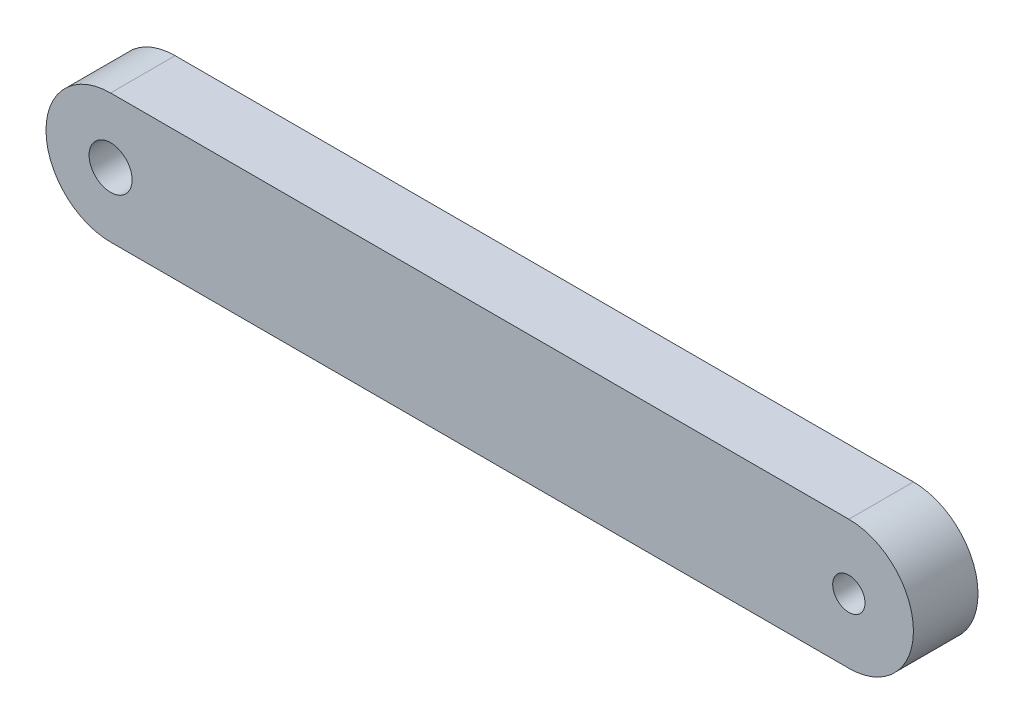
ISO-10303-21;
HEADER;
FILE_DESCRIPTION(('STEP AP214'),'2;1');
FILE_NAME('part.step','',(''),(''),'','','');
FILE_SCHEMA(('AUTOMOTIVE_DESIGN { 1 0 10303 214 1 1 1 1 }'));
ENDSEC;
DATA;
#1=APPLICATION_CONTEXT('core data for automotive mechanical design processes');
#2=APPLICATION_PROTOCOL_DEFINITION('international standard','automotive_design',2000,#1);
#3=PRODUCT_CONTEXT('',#1,'mechanical');
#4=PRODUCT('Part','Part','',(#3));
#5=PRODUCT_RELATED_PRODUCT_CATEGORY('part','',(#4));
#6=PRODUCT_DEFINITION_FORMATION('','',#4);
#7=PRODUCT_DEFINITION_CONTEXT('part definition',#1,'design');
#8=PRODUCT_DEFINITION('design','',#6,#7);
#9=PRODUCT_DEFINITION_SHAPE('','',#8);
#10=(LENGTH_UNIT() NAMED_UNIT(*) SI_UNIT(.MILLI.,.METRE.));
#11=(NAMED_UNIT(*) PLANE_ANGLE_UNIT() SI_UNIT($,.RADIAN.));
#12=(NAMED_UNIT(*) SI_UNIT($,.STERADIAN.) SOLID_ANGLE_UNIT());
#13=UNCERTAINTY_MEASURE_WITH_UNIT(LENGTH_MEASURE(1.E-05),#10,'distance_accuracy_value','');
#14=(GEOMETRIC_REPRESENTATION_CONTEXT(3) GLOBAL_UNCERTAINTY_ASSIGNED_CONTEXT((#13)) GLOBAL_UNIT_ASSIGNED_CONTEXT((#10,
#11,#12)) REPRESENTATION_CONTEXT('',''));
#15=CARTESIAN_POINT('',(0.,0.,0.));
#16=DIRECTION('',(0.,0.,1.));
#17=DIRECTION('',(1.,0.,0.));
#18=AXIS2_PLACEMENT_3D('',#15,#16,#17);
#19=CARTESIAN_POINT('',(-16.1947840890989,0.,3.));
#20=DIRECTION('',(0.,0.,-1.));
#21=DIRECTION('',(-1.,0.,0.));
#22=AXIS2_PLACEMENT_3D('',#19,#20,#21);
#23=CYLINDRICAL_SURFACE('',#22,3.);
#24=CARTESIAN_POINT('',(-16.1947840890989,0.,0.));
#25=DIRECTION('',(0.,0.,1.));
#26=DIRECTION('',(1.,0.,0.));
#27=AXIS2_PLACEMENT_3D('',#24,#25,#26);
#28=CIRCLE('',#27,3.);
#29=CARTESIAN_POINT('',(-16.1947840890989,3.,0.));
#30=VERTEX_POINT('',#29);
#31=CARTESIAN_POINT('',(-16.1947840890989,-3.,0.));
#32=VERTEX_POINT('',#31);
#33=EDGE_CURVE('E111',#30,#32,#28,.T.);
#34=ORIENTED_EDGE('',*,*,#33,.T.);
#35=DIRECTION('',(0.,0.,-1.));
#36=VECTOR('',#35,1.);
#37=CARTESIAN_POINT('',(-16.1947840890989,-3.,3.));
#38=LINE('',#37,#36);
#39=CARTESIAN_POINT('',(-16.1947840890989,-3.,3.));
#40=VERTEX_POINT('',#39);
#41=EDGE_CURVE('E12',#40,#32,#38,.T.);
#42=ORIENTED_EDGE('',*,*,#41,.F.);
#43=CARTESIAN_POINT('',(-16.1947840890989,0.,3.));
#44=DIRECTION('',(0.,0.,1.));
#45=DIRECTION('',(1.,0.,0.));
#46=AXIS2_PLACEMENT_3D('',#43,#44,#45);
#47=CIRCLE('',#46,3.);
#48=CARTESIAN_POINT('',(-16.1947840890989,3.,3.));
#49=VERTEX_POINT('',#48);
#50=EDGE_CURVE('E95',#49,#40,#47,.T.);
#51=ORIENTED_EDGE('',*,*,#50,.F.);
#52=DIRECTION('',(0.,0.,-1.));
#53=VECTOR('',#52,1.);
#54=CARTESIAN_POINT('',(-16.1947840890989,3.,3.));
#55=LINE('',#54,#53);
#56=EDGE_CURVE('E107',#49,#30,#55,.T.);
#57=ORIENTED_EDGE('',*,*,#56,.T.);
#58=EDGE_LOOP('',(#34,#42,#51,#57));
#59=FACE_BOUND('',#58,.T.);
#60=ADVANCED_FACE('F43',(#59),#23,.T.);
#61=CARTESIAN_POINT('',(-16.1947840890989,-3.,3.));
#62=DIRECTION('',(0.,1.,0.));
#63=DIRECTION('',(0.,0.,1.));
#64=AXIS2_PLACEMENT_3D('',#61,#62,#63);
#65=PLANE('',#64);
#66=DIRECTION('',(1.,0.,0.));
#67=VECTOR('',#66,1.);
#68=CARTESIAN_POINT('',(-16.1947840890989,-3.,0.));
#69=LINE('',#68,#67);
#70=CARTESIAN_POINT('',(18.1052159109011,-3.,0.));
#71=VERTEX_POINT('',#70);
#72=EDGE_CURVE('E100',#32,#71,#69,.T.);
#73=ORIENTED_EDGE('',*,*,#72,.T.);
#74=DIRECTION('',(0.,0.,-1.));
#75=VECTOR('',#74,1.);
#76=CARTESIAN_POINT('',(18.1052159109011,-3.,3.));
#77=LINE('',#76,#75);
#78=CARTESIAN_POINT('',(18.1052159109011,-3.,3.));
#79=VERTEX_POINT('',#78);
#80=EDGE_CURVE('E52',#79,#71,#77,.T.);
#81=ORIENTED_EDGE('',*,*,#80,.F.);
#82=DIRECTION('',(1.,0.,0.));
#83=VECTOR('',#82,1.);
#84=CARTESIAN_POINT('',(-16.1947840890989,-3.,3.));
#85=LINE('',#84,#83);
#86=EDGE_CURVE('E90',#40,#79,#85,.T.);
#87=ORIENTED_EDGE('',*,*,#86,.F.);
#88=ORIENTED_EDGE('',*,*,#41,.T.);
#89=EDGE_LOOP('',(#73,#81,#87,#88));
#90=FACE_BOUND('',#89,.T.);
#91=ADVANCED_FACE('F99',(#90),#65,.F.);
#92=CARTESIAN_POINT('',(18.1052159109011,0.,3.));
#93=DIRECTION('',(0.,0.,-1.));
#94=DIRECTION('',(-1.,0.,0.));
#95=AXIS2_PLACEMENT_3D('',#92,#93,#94);
#96=CYLINDRICAL_SURFACE('',#95,3.);
#97=CARTESIAN_POINT('',(18.1052159109011,0.,0.));
#98=DIRECTION('',(0.,0.,1.));
#99=DIRECTION('',(1.,0.,0.));
#100=AXIS2_PLACEMENT_3D('',#97,#98,#99);
#101=CIRCLE('',#100,3.);
#102=CARTESIAN_POINT('',(18.1052159109011,3.,0.));
#103=VERTEX_POINT('',#102);
#104=EDGE_CURVE('E77',#71,#103,#101,.T.);
#105=ORIENTED_EDGE('',*,*,#104,.T.);
#106=DIRECTION('',(0.,0.,-1.));
#107=VECTOR('',#106,1.);
#108=CARTESIAN_POINT('',(18.1052159109011,3.,3.));
#109=LINE('',#108,#107);
#110=CARTESIAN_POINT('',(18.1052159109011,3.,3.));
#111=VERTEX_POINT('',#110);
#112=EDGE_CURVE('E102',#111,#103,#109,.T.);
#113=ORIENTED_EDGE('',*,*,#112,.F.);
#114=CARTESIAN_POINT('',(18.1052159109011,0.,3.));
#115=DIRECTION('',(0.,0.,1.));
#116=DIRECTION('',(1.,0.,0.));
#117=AXIS2_PLACEMENT_3D('',#114,#115,#116);
#118=CIRCLE('',#117,3.);
#119=EDGE_CURVE('E93',#79,#111,#118,.T.);
#120=ORIENTED_EDGE('',*,*,#119,.F.);
#121=ORIENTED_EDGE('',*,*,#80,.T.);
#122=EDGE_LOOP('',(#105,#113,#120,#121));
#123=FACE_BOUND('',#122,.T.);
#124=ADVANCED_FACE('F103',(#123),#96,.T.);
#125=CARTESIAN_POINT('',(-16.1947840890989,3.,3.));
#126=DIRECTION('',(0.,-1.,0.));
#127=DIRECTION('',(0.,0.,-1.));
#128=AXIS2_PLACEMENT_3D('',#125,#126,#127);
#129=PLANE('',#128);
#130=DIRECTION('',(-1.,0.,0.));
#131=VECTOR('',#130,1.);
#132=CARTESIAN_POINT('',(-16.1947840890989,3.,0.));
#133=LINE('',#132,#131);
#134=EDGE_CURVE('E83',#103,#30,#133,.T.);
#135=ORIENTED_EDGE('',*,*,#134,.T.);
#136=ORIENTED_EDGE('',*,*,#56,.F.);
#137=DIRECTION('',(-1.,0.,0.));
#138=VECTOR('',#137,1.);
#139=CARTESIAN_POINT('',(-16.1947840890989,3.,3.));
#140=LINE('',#139,#138);
#141=EDGE_CURVE('E60',#111,#49,#140,.T.);
#142=ORIENTED_EDGE('',*,*,#141,.F.);
#143=ORIENTED_EDGE('',*,*,#112,.T.);
#144=EDGE_LOOP('',(#135,#136,#142,#143));
#145=FACE_BOUND('',#144,.T.);
#146=ADVANCED_FACE('F125',(#145),#129,.F.);
#147=CARTESIAN_POINT('',(-16.1947840890989,0.,3.));
#148=DIRECTION('',(0.,0.,1.));
#149=DIRECTION('',(1.,0.,0.));
#150=AXIS2_PLACEMENT_3D('',#147,#148,#149);
#151=PLANE('',#150);
#152=CARTESIAN_POINT('',(18.1052159109011,0.,3.));
#153=DIRECTION('',(0.,0.,1.));
#154=DIRECTION('',(1.,0.,0.));
#155=AXIS2_PLACEMENT_3D('',#152,#153,#154);
#156=CIRCLE('',#155,0.749999999999998);
#157=CARTESIAN_POINT('',(18.8552159109011,0.,3.));
#158=VERTEX_POINT('',#157);
#159=EDGE_CURVE('E140',#158,#158,#156,.T.);
#160=ORIENTED_EDGE('',*,*,#159,.F.);
#161=EDGE_LOOP('',(#160));
#162=FACE_BOUND('',#161,.T.);
#163=CARTESIAN_POINT('',(-16.1947840890989,0.,3.));
#164=DIRECTION('',(0.,0.,1.));
#165=DIRECTION('',(1.,0.,0.));
#166=AXIS2_PLACEMENT_3D('',#163,#164,#165);
#167=CIRCLE('',#166,1.);
#168=CARTESIAN_POINT('',(-15.1947840890989,0.,3.));
#169=VERTEX_POINT('',#168);
#170=EDGE_CURVE('E132',#169,#169,#167,.T.);
#171=ORIENTED_EDGE('',*,*,#170,.F.);
#172=EDGE_LOOP('',(#171));
#173=FACE_BOUND('',#172,.T.);
#174=ORIENTED_EDGE('',*,*,#50,.T.);
#175=ORIENTED_EDGE('',*,*,#86,.T.);
#176=ORIENTED_EDGE('',*,*,#119,.T.);
#177=ORIENTED_EDGE('',*,*,#141,.T.);
#178=EDGE_LOOP('',(#174,#175,#176,#177));
#179=FACE_BOUND('',#178,.T.);
#180=ADVANCED_FACE('F91',(#162,#173,#179),#151,.T.);
#181=CARTESIAN_POINT('',(-16.1947840890989,0.,0.));
#182=DIRECTION('',(0.,0.,1.));
#183=DIRECTION('',(1.,0.,0.));
#184=AXIS2_PLACEMENT_3D('',#181,#182,#183);
#185=PLANE('',#184);
#186=CARTESIAN_POINT('',(18.1052159109011,0.,0.));
#187=DIRECTION('',(0.,0.,1.));
#188=DIRECTION('',(1.,0.,0.));
#189=AXIS2_PLACEMENT_3D('',#186,#187,#188);
#190=CIRCLE('',#189,0.749999999999998);
#191=CARTESIAN_POINT('',(18.8552159109011,0.,0.));
#192=VERTEX_POINT('',#191);
#193=EDGE_CURVE('E115',#192,#192,#190,.T.);
#194=ORIENTED_EDGE('',*,*,#193,.T.);
#195=EDGE_LOOP('',(#194));
#196=FACE_BOUND('',#195,.T.);
#197=CARTESIAN_POINT('',(-16.1947840890989,0.,0.));
#198=DIRECTION('',(0.,0.,1.));
#199=DIRECTION('',(1.,0.,0.));
#200=AXIS2_PLACEMENT_3D('',#197,#198,#199);
#201=CIRCLE('',#200,1.);
#202=CARTESIAN_POINT('',(-15.1947840890989,0.,0.));
#203=VERTEX_POINT('',#202);
#204=EDGE_CURVE('E136',#203,#203,#201,.T.);
#205=ORIENTED_EDGE('',*,*,#204,.T.);
#206=EDGE_LOOP('',(#205));
#207=FACE_BOUND('',#206,.T.);
#208=ORIENTED_EDGE('',*,*,#33,.F.);
#209=ORIENTED_EDGE('',*,*,#134,.F.);
#210=ORIENTED_EDGE('',*,*,#104,.F.);
#211=ORIENTED_EDGE('',*,*,#72,.F.);
#212=EDGE_LOOP('',(#208,#209,#210,#211));
#213=FACE_BOUND('',#212,.T.);
#214=ADVANCED_FACE('F128',(#196,#207,#213),#185,.F.);
#215=CARTESIAN_POINT('',(-16.1947840890989,0.,0.));
#216=DIRECTION('',(0.,0.,1.));
#217=DIRECTION('',(1.,0.,0.));
#218=AXIS2_PLACEMENT_3D('',#215,#216,#217);
#219=CYLINDRICAL_SURFACE('',#218,1.);
#220=ORIENTED_EDGE('',*,*,#204,.F.);
#221=EDGE_LOOP('',(#220));
#222=FACE_BOUND('',#221,.T.);
#223=ORIENTED_EDGE('',*,*,#170,.T.);
#224=EDGE_LOOP('',(#223));
#225=FACE_BOUND('',#224,.T.);
#226=ADVANCED_FACE('F153',(#222,#225),#219,.F.);
#227=CARTESIAN_POINT('',(18.1052159109011,0.,0.));
#228=DIRECTION('',(0.,0.,1.));
#229=DIRECTION('',(1.,0.,0.));
#230=AXIS2_PLACEMENT_3D('',#227,#228,#229);
#231=CYLINDRICAL_SURFACE('',#230,0.749999999999998);
#232=ORIENTED_EDGE('',*,*,#193,.F.);
#233=EDGE_LOOP('',(#232));
#234=FACE_BOUND('',#233,.T.);
#235=ORIENTED_EDGE('',*,*,#159,.T.);
#236=EDGE_LOOP('',(#235));
#237=FACE_BOUND('',#236,.T.);
#238=ADVANCED_FACE('F150',(#234,#237),#231,.F.);
#239=CLOSED_SHELL('',(#60,#91,#124,#146,#180,#214,#226,#238));
#240=MANIFOLD_SOLID_BREP('B2',#239);
#241=ADVANCED_BREP_SHAPE_REPRESENTATION('',(#18,#240),#14);
#242=SHAPE_DEFINITION_REPRESENTATION(#9,#241);
ENDSEC;
END-ISO-10303-21;
